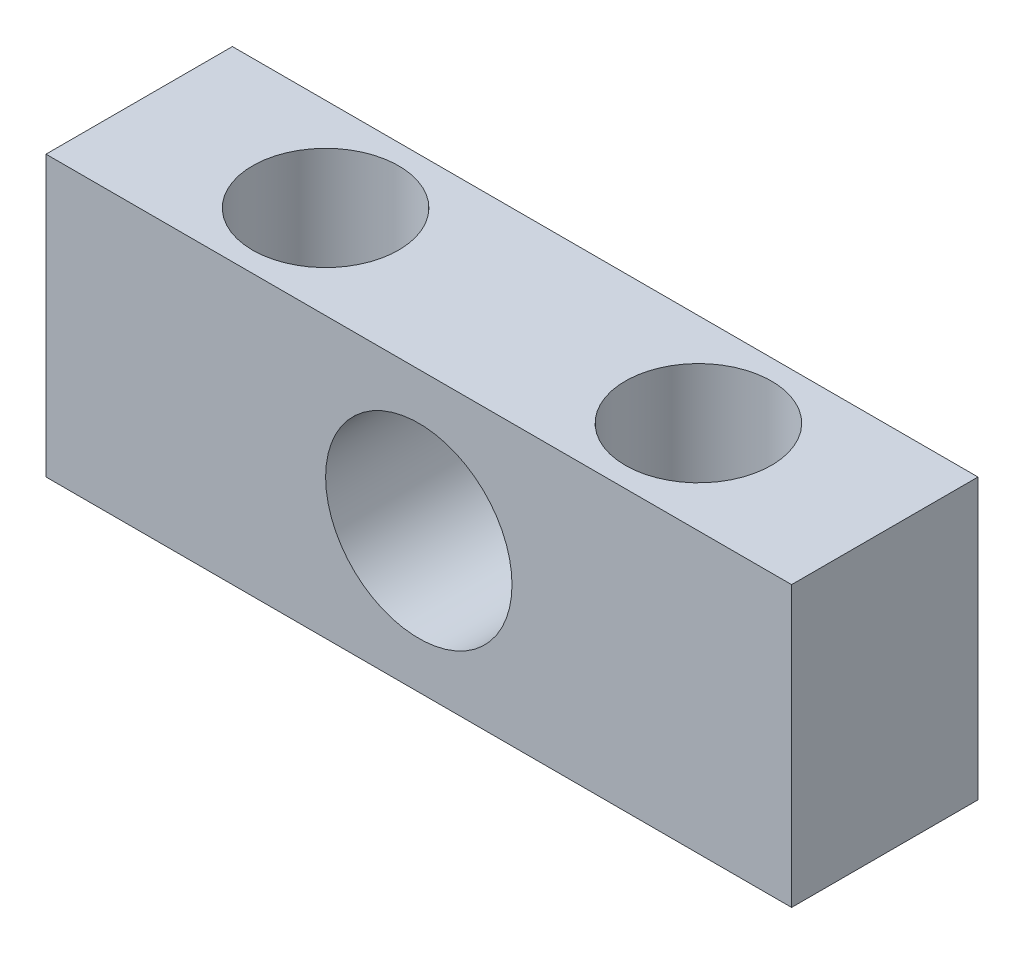
ISO-10303-21;
HEADER;
FILE_DESCRIPTION(('STEP AP214'),'2;1');
FILE_NAME('part.step','',(''),(''),'','','');
FILE_SCHEMA(('AUTOMOTIVE_DESIGN { 1 0 10303 214 1 1 1 1 }'));
ENDSEC;
DATA;
#1=APPLICATION_CONTEXT('core data for automotive mechanical design processes');
#2=APPLICATION_PROTOCOL_DEFINITION('international standard','automotive_design',2000,#1);
#3=PRODUCT_CONTEXT('',#1,'mechanical');
#4=PRODUCT('Part','Part','',(#3));
#5=PRODUCT_RELATED_PRODUCT_CATEGORY('part','',(#4));
#6=PRODUCT_DEFINITION_FORMATION('','',#4);
#7=PRODUCT_DEFINITION_CONTEXT('part definition',#1,'design');
#8=PRODUCT_DEFINITION('design','',#6,#7);
#9=PRODUCT_DEFINITION_SHAPE('','',#8);
#10=(LENGTH_UNIT() NAMED_UNIT(*) SI_UNIT(.MILLI.,.METRE.));
#11=(NAMED_UNIT(*) PLANE_ANGLE_UNIT() SI_UNIT($,.RADIAN.));
#12=(NAMED_UNIT(*) SI_UNIT($,.STERADIAN.) SOLID_ANGLE_UNIT());
#13=UNCERTAINTY_MEASURE_WITH_UNIT(LENGTH_MEASURE(1.E-05),#10,'distance_accuracy_value','');
#14=(GEOMETRIC_REPRESENTATION_CONTEXT(3) GLOBAL_UNCERTAINTY_ASSIGNED_CONTEXT((#13)) GLOBAL_UNIT_ASSIGNED_CONTEXT((#10,
#11,#12)) REPRESENTATION_CONTEXT('',''));
#15=CARTESIAN_POINT('',(0.,0.,0.));
#16=DIRECTION('',(0.,0.,1.));
#17=DIRECTION('',(1.,0.,0.));
#18=AXIS2_PLACEMENT_3D('',#15,#16,#17);
#19=CARTESIAN_POINT('',(0.,0.,3.175));
#20=DIRECTION('',(0.,0.,-1.));
#21=DIRECTION('',(-1.,0.,0.));
#22=AXIS2_PLACEMENT_3D('',#19,#20,#21);
#23=PLANE('',#22);
#24=DIRECTION('',(0.,1.,0.));
#25=VECTOR('',#24,1.);
#26=CARTESIAN_POINT('',(12.7,-4.7625,3.175));
#27=LINE('',#26,#25);
#28=CARTESIAN_POINT('',(12.7,-4.7625,3.175));
#29=VERTEX_POINT('',#28);
#30=CARTESIAN_POINT('',(12.7,4.7625,3.175));
#31=VERTEX_POINT('',#30);
#32=EDGE_CURVE('E98',#29,#31,#27,.T.);
#33=ORIENTED_EDGE('',*,*,#32,.T.);
#34=DIRECTION('',(-1.,0.,0.));
#35=VECTOR('',#34,1.);
#36=CARTESIAN_POINT('',(-12.7,4.7625,3.175));
#37=LINE('',#36,#35);
#38=CARTESIAN_POINT('',(-12.7,4.7625,3.175));
#39=VERTEX_POINT('',#38);
#40=EDGE_CURVE('E93',#31,#39,#37,.T.);
#41=ORIENTED_EDGE('',*,*,#40,.T.);
#42=DIRECTION('',(0.,-1.,0.));
#43=VECTOR('',#42,1.);
#44=CARTESIAN_POINT('',(-12.7,-4.7625,3.175));
#45=LINE('',#44,#43);
#46=CARTESIAN_POINT('',(-12.7,-4.7625,3.175));
#47=VERTEX_POINT('',#46);
#48=EDGE_CURVE('E96',#39,#47,#45,.T.);
#49=ORIENTED_EDGE('',*,*,#48,.T.);
#50=DIRECTION('',(1.,0.,0.));
#51=VECTOR('',#50,1.);
#52=CARTESIAN_POINT('',(-12.7,-4.7625,3.175));
#53=LINE('',#52,#51);
#54=EDGE_CURVE('E63',#47,#29,#53,.T.);
#55=ORIENTED_EDGE('',*,*,#54,.T.);
#56=EDGE_LOOP('',(#33,#41,#49,#55));
#57=FACE_BOUND('',#56,.T.);
#58=CARTESIAN_POINT('',(0.,0.,3.175));
#59=DIRECTION('',(0.,0.,1.));
#60=DIRECTION('',(1.,0.,0.));
#61=AXIS2_PLACEMENT_3D('',#58,#59,#60);
#62=CIRCLE('',#61,3.175);
#63=CARTESIAN_POINT('',(3.175,0.,3.175));
#64=VERTEX_POINT('',#63);
#65=EDGE_CURVE('E118',#64,#64,#62,.T.);
#66=ORIENTED_EDGE('',*,*,#65,.F.);
#67=EDGE_LOOP('',(#66));
#68=FACE_BOUND('',#67,.T.);
#69=ADVANCED_FACE('F45',(#57,#68),#23,.F.);
#70=CARTESIAN_POINT('',(0.,0.,-3.175));
#71=DIRECTION('',(0.,0.,-1.));
#72=DIRECTION('',(-1.,0.,0.));
#73=AXIS2_PLACEMENT_3D('',#70,#71,#72);
#74=PLANE('',#73);
#75=DIRECTION('',(0.,1.,0.));
#76=VECTOR('',#75,1.);
#77=CARTESIAN_POINT('',(12.7,-4.7625,-3.175));
#78=LINE('',#77,#76);
#79=CARTESIAN_POINT('',(12.7,-4.7625,-3.175));
#80=VERTEX_POINT('',#79);
#81=CARTESIAN_POINT('',(12.7,4.7625,-3.175));
#82=VERTEX_POINT('',#81);
#83=EDGE_CURVE('E114',#80,#82,#78,.T.);
#84=ORIENTED_EDGE('',*,*,#83,.F.);
#85=DIRECTION('',(1.,0.,0.));
#86=VECTOR('',#85,1.);
#87=CARTESIAN_POINT('',(-12.7,-4.7625,-3.175));
#88=LINE('',#87,#86);
#89=CARTESIAN_POINT('',(-12.7,-4.7625,-3.175));
#90=VERTEX_POINT('',#89);
#91=EDGE_CURVE('E86',#90,#80,#88,.T.);
#92=ORIENTED_EDGE('',*,*,#91,.F.);
#93=DIRECTION('',(0.,-1.,0.));
#94=VECTOR('',#93,1.);
#95=CARTESIAN_POINT('',(-12.7,-4.7625,-3.175));
#96=LINE('',#95,#94);
#97=CARTESIAN_POINT('',(-12.7,4.7625,-3.175));
#98=VERTEX_POINT('',#97);
#99=EDGE_CURVE('E80',#98,#90,#96,.T.);
#100=ORIENTED_EDGE('',*,*,#99,.F.);
#101=DIRECTION('',(-1.,0.,0.));
#102=VECTOR('',#101,1.);
#103=CARTESIAN_POINT('',(-12.7,4.7625,-3.175));
#104=LINE('',#103,#102);
#105=EDGE_CURVE('E103',#82,#98,#104,.T.);
#106=ORIENTED_EDGE('',*,*,#105,.F.);
#107=EDGE_LOOP('',(#84,#92,#100,#106));
#108=FACE_BOUND('',#107,.T.);
#109=CARTESIAN_POINT('',(0.,0.,-3.175));
#110=DIRECTION('',(0.,0.,1.));
#111=DIRECTION('',(1.,0.,0.));
#112=AXIS2_PLACEMENT_3D('',#109,#110,#111);
#113=CIRCLE('',#112,3.175);
#114=CARTESIAN_POINT('',(3.175,0.,-3.175));
#115=VERTEX_POINT('',#114);
#116=EDGE_CURVE('E136',#115,#115,#113,.T.);
#117=ORIENTED_EDGE('',*,*,#116,.T.);
#118=EDGE_LOOP('',(#117));
#119=FACE_BOUND('',#118,.T.);
#120=ADVANCED_FACE('F131',(#108,#119),#74,.T.);
#121=CARTESIAN_POINT('',(12.7,-4.7625,3.175));
#122=DIRECTION('',(-1.,0.,0.));
#123=DIRECTION('',(0.,-1.,0.));
#124=AXIS2_PLACEMENT_3D('',#121,#122,#123);
#125=PLANE('',#124);
#126=ORIENTED_EDGE('',*,*,#83,.T.);
#127=DIRECTION('',(0.,0.,-1.));
#128=VECTOR('',#127,1.);
#129=CARTESIAN_POINT('',(12.7,4.7625,3.175));
#130=LINE('',#129,#128);
#131=EDGE_CURVE('E11',#31,#82,#130,.T.);
#132=ORIENTED_EDGE('',*,*,#131,.F.);
#133=ORIENTED_EDGE('',*,*,#32,.F.);
#134=DIRECTION('',(0.,0.,-1.));
#135=VECTOR('',#134,1.);
#136=CARTESIAN_POINT('',(12.7,-4.7625,3.175));
#137=LINE('',#136,#135);
#138=EDGE_CURVE('E110',#29,#80,#137,.T.);
#139=ORIENTED_EDGE('',*,*,#138,.T.);
#140=EDGE_LOOP('',(#126,#132,#133,#139));
#141=FACE_BOUND('',#140,.T.);
#142=ADVANCED_FACE('F47',(#141),#125,.F.);
#143=CARTESIAN_POINT('',(-12.7,4.7625,3.175));
#144=DIRECTION('',(0.,-1.,0.));
#145=DIRECTION('',(1.,0.,0.));
#146=AXIS2_PLACEMENT_3D('',#143,#144,#145);
#147=PLANE('',#146);
#148=CARTESIAN_POINT('',(6.35,4.7625,0.));
#149=DIRECTION('',(0.,1.,0.));
#150=DIRECTION('',(0.,0.,1.));
#151=AXIS2_PLACEMENT_3D('',#148,#149,#150);
#152=CIRCLE('',#151,2.4892);
#153=CARTESIAN_POINT('',(6.35,4.7625,2.4892));
#154=VERTEX_POINT('',#153);
#155=EDGE_CURVE('E148',#154,#154,#152,.T.);
#156=ORIENTED_EDGE('',*,*,#155,.F.);
#157=EDGE_LOOP('',(#156));
#158=FACE_BOUND('',#157,.T.);
#159=CARTESIAN_POINT('',(-6.35,4.7625,0.));
#160=DIRECTION('',(0.,1.,0.));
#161=DIRECTION('',(0.,0.,1.));
#162=AXIS2_PLACEMENT_3D('',#159,#160,#161);
#163=CIRCLE('',#162,2.4892);
#164=CARTESIAN_POINT('',(-6.35,4.7625,2.4892));
#165=VERTEX_POINT('',#164);
#166=EDGE_CURVE('E144',#165,#165,#163,.T.);
#167=ORIENTED_EDGE('',*,*,#166,.F.);
#168=EDGE_LOOP('',(#167));
#169=FACE_BOUND('',#168,.T.);
#170=ORIENTED_EDGE('',*,*,#105,.T.);
#171=DIRECTION('',(0.,0.,-1.));
#172=VECTOR('',#171,1.);
#173=CARTESIAN_POINT('',(-12.7,4.7625,3.175));
#174=LINE('',#173,#172);
#175=EDGE_CURVE('E55',#39,#98,#174,.T.);
#176=ORIENTED_EDGE('',*,*,#175,.F.);
#177=ORIENTED_EDGE('',*,*,#40,.F.);
#178=ORIENTED_EDGE('',*,*,#131,.T.);
#179=EDGE_LOOP('',(#170,#176,#177,#178));
#180=FACE_BOUND('',#179,.T.);
#181=ADVANCED_FACE('F102',(#158,#169,#180),#147,.F.);
#182=CARTESIAN_POINT('',(-12.7,-4.7625,3.175));
#183=DIRECTION('',(1.,0.,0.));
#184=DIRECTION('',(0.,0.,-1.));
#185=AXIS2_PLACEMENT_3D('',#182,#183,#184);
#186=PLANE('',#185);
#187=ORIENTED_EDGE('',*,*,#99,.T.);
#188=DIRECTION('',(0.,0.,-1.));
#189=VECTOR('',#188,1.);
#190=CARTESIAN_POINT('',(-12.7,-4.7625,3.175));
#191=LINE('',#190,#189);
#192=EDGE_CURVE('E105',#47,#90,#191,.T.);
#193=ORIENTED_EDGE('',*,*,#192,.F.);
#194=ORIENTED_EDGE('',*,*,#48,.F.);
#195=ORIENTED_EDGE('',*,*,#175,.T.);
#196=EDGE_LOOP('',(#187,#193,#194,#195));
#197=FACE_BOUND('',#196,.T.);
#198=ADVANCED_FACE('F106',(#197),#186,.F.);
#199=CARTESIAN_POINT('',(-12.7,-4.7625,3.175));
#200=DIRECTION('',(0.,1.,0.));
#201=DIRECTION('',(0.,0.,1.));
#202=AXIS2_PLACEMENT_3D('',#199,#200,#201);
#203=PLANE('',#202);
#204=CARTESIAN_POINT('',(6.35,-4.7625,0.));
#205=DIRECTION('',(0.,1.,0.));
#206=DIRECTION('',(0.,0.,1.));
#207=AXIS2_PLACEMENT_3D('',#204,#205,#206);
#208=CIRCLE('',#207,2.4892);
#209=CARTESIAN_POINT('',(6.35,-4.7625,2.4892));
#210=VERTEX_POINT('',#209);
#211=EDGE_CURVE('E140',#210,#210,#208,.T.);
#212=ORIENTED_EDGE('',*,*,#211,.T.);
#213=EDGE_LOOP('',(#212));
#214=FACE_BOUND('',#213,.T.);
#215=CARTESIAN_POINT('',(-6.35,-4.7625,0.));
#216=DIRECTION('',(0.,1.,0.));
#217=DIRECTION('',(0.,0.,1.));
#218=AXIS2_PLACEMENT_3D('',#215,#216,#217);
#219=CIRCLE('',#218,2.4892);
#220=CARTESIAN_POINT('',(-6.35,-4.7625,2.4892));
#221=VERTEX_POINT('',#220);
#222=EDGE_CURVE('E149',#221,#221,#219,.T.);
#223=ORIENTED_EDGE('',*,*,#222,.T.);
#224=EDGE_LOOP('',(#223));
#225=FACE_BOUND('',#224,.T.);
#226=ORIENTED_EDGE('',*,*,#91,.T.);
#227=ORIENTED_EDGE('',*,*,#138,.F.);
#228=ORIENTED_EDGE('',*,*,#54,.F.);
#229=ORIENTED_EDGE('',*,*,#192,.T.);
#230=EDGE_LOOP('',(#226,#227,#228,#229));
#231=FACE_BOUND('',#230,.T.);
#232=ADVANCED_FACE('F128',(#214,#225,#231),#203,.F.);
#233=CARTESIAN_POINT('',(0.,0.,3.175));
#234=DIRECTION('',(0.,0.,-1.));
#235=DIRECTION('',(-1.,0.,0.));
#236=AXIS2_PLACEMENT_3D('',#233,#234,#235);
#237=CYLINDRICAL_SURFACE('',#236,3.175);
#238=ORIENTED_EDGE('',*,*,#65,.T.);
#239=EDGE_LOOP('',(#238));
#240=FACE_BOUND('',#239,.T.);
#241=ORIENTED_EDGE('',*,*,#116,.F.);
#242=EDGE_LOOP('',(#241));
#243=FACE_BOUND('',#242,.T.);
#244=ADVANCED_FACE('F168',(#240,#243),#237,.F.);
#245=CARTESIAN_POINT('',(-6.35,-4.7625,0.));
#246=DIRECTION('',(0.,1.,0.));
#247=DIRECTION('',(0.,0.,1.));
#248=AXIS2_PLACEMENT_3D('',#245,#246,#247);
#249=CYLINDRICAL_SURFACE('',#248,2.4892);
#250=ORIENTED_EDGE('',*,*,#222,.F.);
#251=EDGE_LOOP('',(#250));
#252=FACE_BOUND('',#251,.T.);
#253=ORIENTED_EDGE('',*,*,#166,.T.);
#254=EDGE_LOOP('',(#253));
#255=FACE_BOUND('',#254,.T.);
#256=ADVANCED_FACE('F166',(#252,#255),#249,.F.);
#257=CARTESIAN_POINT('',(6.35,-4.7625,0.));
#258=DIRECTION('',(0.,1.,0.));
#259=DIRECTION('',(0.,0.,1.));
#260=AXIS2_PLACEMENT_3D('',#257,#258,#259);
#261=CYLINDRICAL_SURFACE('',#260,2.4892);
#262=ORIENTED_EDGE('',*,*,#211,.F.);
#263=EDGE_LOOP('',(#262));
#264=FACE_BOUND('',#263,.T.);
#265=ORIENTED_EDGE('',*,*,#155,.T.);
#266=EDGE_LOOP('',(#265));
#267=FACE_BOUND('',#266,.T.);
#268=ADVANCED_FACE('F160',(#264,#267),#261,.F.);
#269=CLOSED_SHELL('',(#69,#120,#142,#181,#198,#232,#244,#256,#268));
#270=MANIFOLD_SOLID_BREP('B2',#269);
#271=ADVANCED_BREP_SHAPE_REPRESENTATION('',(#18,#270),#14);
#272=SHAPE_DEFINITION_REPRESENTATION(#9,#271);
ENDSEC;
END-ISO-10303-21;
